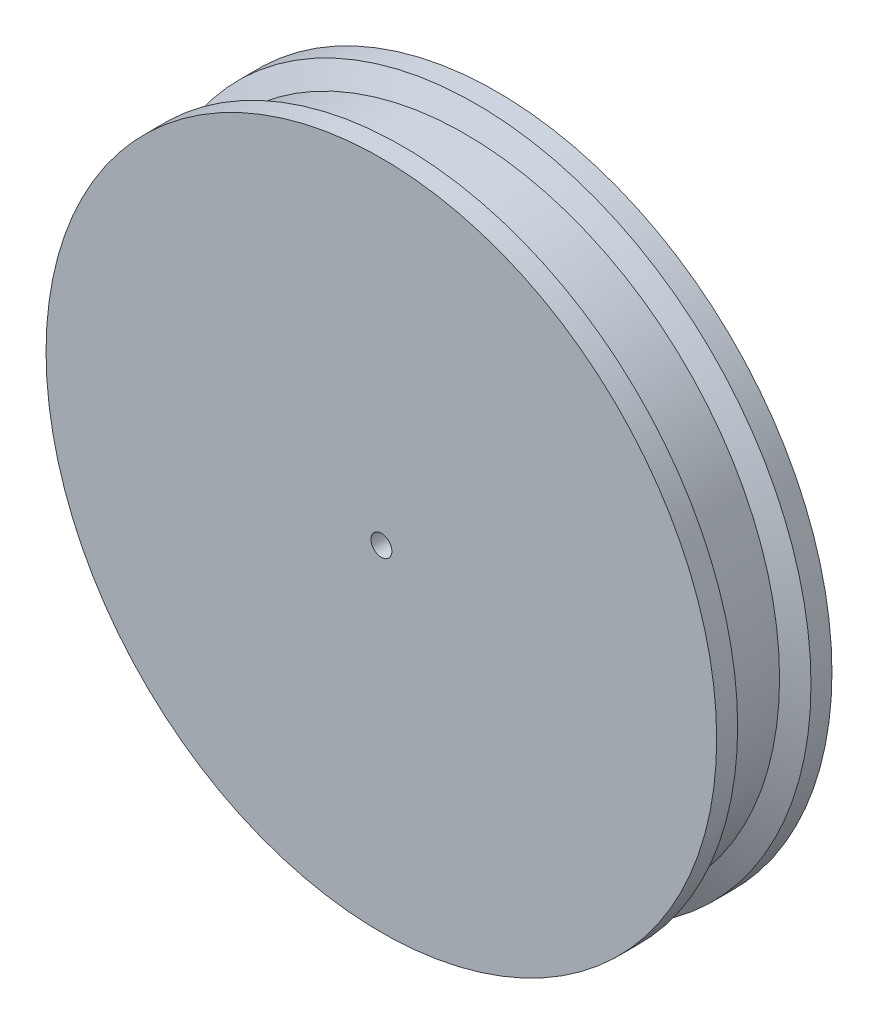
ISO-10303-21;
HEADER;
FILE_DESCRIPTION(('STEP AP214'),'2;1');
FILE_NAME('part.step','',(''),(''),'','','');
FILE_SCHEMA(('AUTOMOTIVE_DESIGN { 1 0 10303 214 1 1 1 1 }'));
ENDSEC;
DATA;
#1=APPLICATION_CONTEXT('core data for automotive mechanical design processes');
#2=APPLICATION_PROTOCOL_DEFINITION('international standard','automotive_design',2000,#1);
#3=PRODUCT_CONTEXT('',#1,'mechanical');
#4=PRODUCT('Part','Part','',(#3));
#5=PRODUCT_RELATED_PRODUCT_CATEGORY('part','',(#4));
#6=PRODUCT_DEFINITION_FORMATION('','',#4);
#7=PRODUCT_DEFINITION_CONTEXT('part definition',#1,'design');
#8=PRODUCT_DEFINITION('design','',#6,#7);
#9=PRODUCT_DEFINITION_SHAPE('','',#8);
#10=(LENGTH_UNIT() NAMED_UNIT(*) SI_UNIT(.MILLI.,.METRE.));
#11=(NAMED_UNIT(*) PLANE_ANGLE_UNIT() SI_UNIT($,.RADIAN.));
#12=(NAMED_UNIT(*) SI_UNIT($,.STERADIAN.) SOLID_ANGLE_UNIT());
#13=UNCERTAINTY_MEASURE_WITH_UNIT(LENGTH_MEASURE(1.E-05),#10,'distance_accuracy_value','');
#14=(GEOMETRIC_REPRESENTATION_CONTEXT(3) GLOBAL_UNCERTAINTY_ASSIGNED_CONTEXT((#13)) GLOBAL_UNIT_ASSIGNED_CONTEXT((#10,
#11,#12)) REPRESENTATION_CONTEXT('',''));
#15=CARTESIAN_POINT('',(0.,0.,0.));
#16=DIRECTION('',(0.,0.,1.));
#17=DIRECTION('',(1.,0.,0.));
#18=AXIS2_PLACEMENT_3D('',#15,#16,#17);
#19=CARTESIAN_POINT('',(0.,0.,11.));
#20=DIRECTION('',(0.,0.,-1.));
#21=DIRECTION('',(-1.,0.,0.));
#22=AXIS2_PLACEMENT_3D('',#19,#20,#21);
#23=CYLINDRICAL_SURFACE('',#22,32.);
#24=CARTESIAN_POINT('',(0.,0.,0.));
#25=DIRECTION('',(0.,0.,1.));
#26=DIRECTION('',(1.,0.,0.));
#27=AXIS2_PLACEMENT_3D('',#24,#25,#26);
#28=CIRCLE('',#27,32.);
#29=CARTESIAN_POINT('',(32.,0.,0.));
#30=VERTEX_POINT('',#29);
#31=EDGE_CURVE('E44',#30,#30,#28,.T.);
#32=ORIENTED_EDGE('',*,*,#31,.T.);
#33=EDGE_LOOP('',(#32));
#34=FACE_BOUND('',#33,.T.);
#35=CARTESIAN_POINT('',(0.,0.,2.));
#36=DIRECTION('',(0.,0.,1.));
#37=DIRECTION('',(1.,0.,0.));
#38=AXIS2_PLACEMENT_3D('',#35,#36,#37);
#39=CIRCLE('',#38,32.);
#40=CARTESIAN_POINT('',(32.,0.,2.));
#41=VERTEX_POINT('',#40);
#42=EDGE_CURVE('E59',#41,#41,#39,.T.);
#43=ORIENTED_EDGE('',*,*,#42,.F.);
#44=EDGE_LOOP('',(#43));
#45=FACE_BOUND('',#44,.T.);
#46=ADVANCED_FACE('F41',(#34,#45),#23,.T.);
#47=CARTESIAN_POINT('',(0.,0.,11.));
#48=DIRECTION('',(0.,0.,1.));
#49=DIRECTION('',(1.,0.,0.));
#50=AXIS2_PLACEMENT_3D('',#47,#48,#49);
#51=CIRCLE('',#50,32.);
#52=CARTESIAN_POINT('',(32.,0.,11.));
#53=VERTEX_POINT('',#52);
#54=EDGE_CURVE('E10',#53,#53,#51,.T.);
#55=ORIENTED_EDGE('',*,*,#54,.F.);
#56=EDGE_LOOP('',(#55));
#57=FACE_BOUND('',#56,.T.);
#58=CARTESIAN_POINT('',(0.,0.,9.00000000000001));
#59=DIRECTION('',(0.,0.,1.));
#60=DIRECTION('',(1.,0.,0.));
#61=AXIS2_PLACEMENT_3D('',#58,#59,#60);
#62=CIRCLE('',#61,32.);
#63=CARTESIAN_POINT('',(32.,0.,9.00000000000001));
#64=VERTEX_POINT('',#63);
#65=EDGE_CURVE('E74',#64,#64,#62,.T.);
#66=ORIENTED_EDGE('',*,*,#65,.T.);
#67=EDGE_LOOP('',(#66));
#68=FACE_BOUND('',#67,.T.);
#69=ADVANCED_FACE('F79',(#57,#68),#23,.T.);
#70=CARTESIAN_POINT('',(0.,0.,11.));
#71=DIRECTION('',(0.,0.,1.));
#72=DIRECTION('',(1.,0.,0.));
#73=AXIS2_PLACEMENT_3D('',#70,#71,#72);
#74=PLANE('',#73);
#75=ORIENTED_EDGE('',*,*,#54,.T.);
#76=EDGE_LOOP('',(#75));
#77=FACE_BOUND('',#76,.T.);
#78=CARTESIAN_POINT('',(0.,0.,11.));
#79=DIRECTION('',(0.,0.,1.));
#80=DIRECTION('',(1.,0.,0.));
#81=AXIS2_PLACEMENT_3D('',#78,#79,#80);
#82=CIRCLE('',#81,1.);
#83=CARTESIAN_POINT('',(1.,0.,11.));
#84=VERTEX_POINT('',#83);
#85=EDGE_CURVE('E53',#84,#84,#82,.T.);
#86=ORIENTED_EDGE('',*,*,#85,.F.);
#87=EDGE_LOOP('',(#86));
#88=FACE_BOUND('',#87,.T.);
#89=ADVANCED_FACE('F97',(#77,#88),#74,.T.);
#90=CARTESIAN_POINT('',(0.,0.,0.));
#91=DIRECTION('',(0.,0.,1.));
#92=DIRECTION('',(1.,0.,0.));
#93=AXIS2_PLACEMENT_3D('',#90,#91,#92);
#94=PLANE('',#93);
#95=ORIENTED_EDGE('',*,*,#31,.F.);
#96=EDGE_LOOP('',(#95));
#97=FACE_BOUND('',#96,.T.);
#98=CARTESIAN_POINT('',(0.,0.,0.));
#99=DIRECTION('',(0.,0.,1.));
#100=DIRECTION('',(1.,0.,0.));
#101=AXIS2_PLACEMENT_3D('',#98,#99,#100);
#102=CIRCLE('',#101,1.);
#103=CARTESIAN_POINT('',(1.,0.,0.));
#104=VERTEX_POINT('',#103);
#105=EDGE_CURVE('E55',#104,#104,#102,.T.);
#106=ORIENTED_EDGE('',*,*,#105,.T.);
#107=EDGE_LOOP('',(#106));
#108=FACE_BOUND('',#107,.T.);
#109=ADVANCED_FACE('F113',(#97,#108),#94,.F.);
#110=CARTESIAN_POINT('',(0.,0.,11.));
#111=DIRECTION('',(0.,0.,-1.));
#112=DIRECTION('',(-1.,0.,0.));
#113=AXIS2_PLACEMENT_3D('',#110,#111,#112);
#114=CYLINDRICAL_SURFACE('',#113,1.);
#115=ORIENTED_EDGE('',*,*,#85,.T.);
#116=EDGE_LOOP('',(#115));
#117=FACE_BOUND('',#116,.T.);
#118=ORIENTED_EDGE('',*,*,#105,.F.);
#119=EDGE_LOOP('',(#118));
#120=FACE_BOUND('',#119,.T.);
#121=ADVANCED_FACE('F105',(#117,#120),#114,.F.);
#122=CARTESIAN_POINT('',(0.,0.,3.));
#123=DIRECTION('',(0.,0.,-1.));
#124=DIRECTION('',(-1.,0.,0.));
#125=AXIS2_PLACEMENT_3D('',#122,#123,#124);
#126=CONICAL_SURFACE('',#125,30.,1.10714871779409);
#127=ORIENTED_EDGE('',*,*,#42,.T.);
#128=EDGE_LOOP('',(#127));
#129=FACE_BOUND('',#128,.T.);
#130=CARTESIAN_POINT('',(0.,0.,3.));
#131=DIRECTION('',(0.,0.,1.));
#132=DIRECTION('',(1.,0.,0.));
#133=AXIS2_PLACEMENT_3D('',#130,#131,#132);
#134=CIRCLE('',#133,30.);
#135=CARTESIAN_POINT('',(30.,0.,3.));
#136=VERTEX_POINT('',#135);
#137=EDGE_CURVE('E66',#136,#136,#134,.T.);
#138=ORIENTED_EDGE('',*,*,#137,.F.);
#139=EDGE_LOOP('',(#138));
#140=FACE_BOUND('',#139,.T.);
#141=ADVANCED_FACE('F89',(#129,#140),#126,.T.);
#142=CARTESIAN_POINT('',(0.,0.,1000.));
#143=DIRECTION('',(0.,0.,1.));
#144=DIRECTION('',(1.,0.,0.));
#145=AXIS2_PLACEMENT_3D('',#142,#143,#144);
#146=CYLINDRICAL_SURFACE('',#145,30.);
#147=ORIENTED_EDGE('',*,*,#137,.T.);
#148=EDGE_LOOP('',(#147));
#149=FACE_BOUND('',#148,.T.);
#150=CARTESIAN_POINT('',(0.,0.,8.00000000000001));
#151=DIRECTION('',(0.,0.,1.));
#152=DIRECTION('',(1.,0.,0.));
#153=AXIS2_PLACEMENT_3D('',#150,#151,#152);
#154=CIRCLE('',#153,30.);
#155=CARTESIAN_POINT('',(30.,0.,8.00000000000001));
#156=VERTEX_POINT('',#155);
#157=EDGE_CURVE('E70',#156,#156,#154,.T.);
#158=ORIENTED_EDGE('',*,*,#157,.F.);
#159=EDGE_LOOP('',(#158));
#160=FACE_BOUND('',#159,.T.);
#161=ADVANCED_FACE('F83',(#149,#160),#146,.T.);
#162=CARTESIAN_POINT('',(0.,0.,9.00000000000001));
#163=DIRECTION('',(0.,0.,1.));
#164=DIRECTION('',(1.,0.,0.));
#165=AXIS2_PLACEMENT_3D('',#162,#163,#164);
#166=CONICAL_SURFACE('',#165,32.,1.10714871779409);
#167=ORIENTED_EDGE('',*,*,#157,.T.);
#168=EDGE_LOOP('',(#167));
#169=FACE_BOUND('',#168,.T.);
#170=ORIENTED_EDGE('',*,*,#65,.F.);
#171=EDGE_LOOP('',(#170));
#172=FACE_BOUND('',#171,.T.);
#173=ADVANCED_FACE('F81',(#169,#172),#166,.T.);
#174=CLOSED_SHELL('',(#46,#69,#89,#109,#121,#141,#161,#173));
#175=MANIFOLD_SOLID_BREP('B2',#174);
#176=ADVANCED_BREP_SHAPE_REPRESENTATION('',(#18,#175),#14);
#177=SHAPE_DEFINITION_REPRESENTATION(#9,#176);
ENDSEC;
END-ISO-10303-21;
